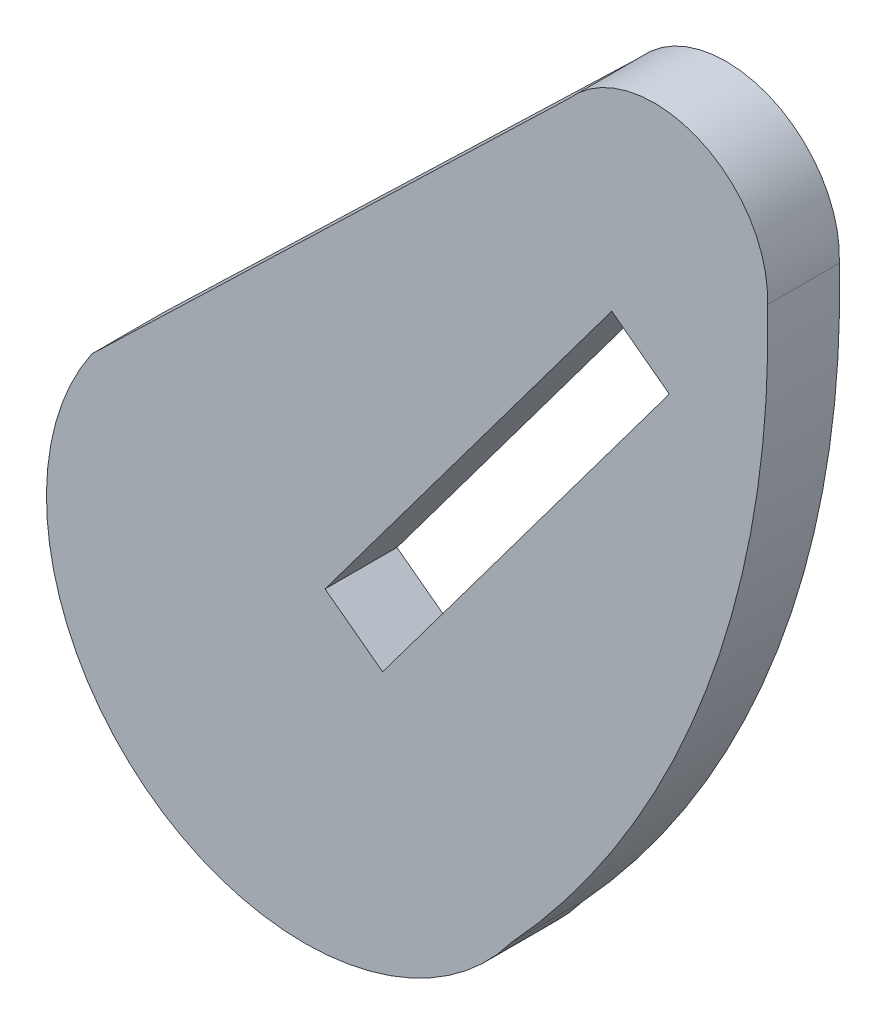
ISO-10303-21;
HEADER;
FILE_DESCRIPTION(('STEP AP214'),'2;1');
FILE_NAME('part.step','',(''),(''),'','','');
FILE_SCHEMA(('AUTOMOTIVE_DESIGN { 1 0 10303 214 1 1 1 1 }'));
ENDSEC;
DATA;
#1=APPLICATION_CONTEXT('core data for automotive mechanical design processes');
#2=APPLICATION_PROTOCOL_DEFINITION('international standard','automotive_design',2000,#1);
#3=PRODUCT_CONTEXT('',#1,'mechanical');
#4=PRODUCT('Part','Part','',(#3));
#5=PRODUCT_RELATED_PRODUCT_CATEGORY('part','',(#4));
#6=PRODUCT_DEFINITION_FORMATION('','',#4);
#7=PRODUCT_DEFINITION_CONTEXT('part definition',#1,'design');
#8=PRODUCT_DEFINITION('design','',#6,#7);
#9=PRODUCT_DEFINITION_SHAPE('','',#8);
#10=(LENGTH_UNIT() NAMED_UNIT(*) SI_UNIT(.MILLI.,.METRE.));
#11=(NAMED_UNIT(*) PLANE_ANGLE_UNIT() SI_UNIT($,.RADIAN.));
#12=(NAMED_UNIT(*) SI_UNIT($,.STERADIAN.) SOLID_ANGLE_UNIT());
#13=UNCERTAINTY_MEASURE_WITH_UNIT(LENGTH_MEASURE(1.E-05),#10,'distance_accuracy_value','');
#14=(GEOMETRIC_REPRESENTATION_CONTEXT(3) GLOBAL_UNCERTAINTY_ASSIGNED_CONTEXT((#13)) GLOBAL_UNIT_ASSIGNED_CONTEXT((#10,
#11,#12)) REPRESENTATION_CONTEXT('',''));
#15=CARTESIAN_POINT('',(0.,0.,0.));
#16=DIRECTION('',(0.,0.,1.));
#17=DIRECTION('',(1.,0.,0.));
#18=AXIS2_PLACEMENT_3D('',#15,#16,#17);
#19=CARTESIAN_POINT('',(-800.658033872501,-117.32718023379,3.));
#20=DIRECTION('',(0.,0.,1.));
#21=DIRECTION('',(1.,0.,0.));
#22=AXIS2_PLACEMENT_3D('',#19,#20,#21);
#23=PLANE('',#22);
#24=CARTESIAN_POINT('',(-800.658033872501,-117.32718023379,3.));
#25=DIRECTION('',(0.,0.,1.));
#26=DIRECTION('',(1.,0.,0.));
#27=AXIS2_PLACEMENT_3D('',#24,#25,#26);
#28=CIRCLE('',#27,10.7666614434912);
#29=CARTESIAN_POINT('',(-809.531671810658,-111.229676778992,3.));
#30=VERTEX_POINT('',#29);
#31=CARTESIAN_POINT('',(-792.031629072118,-123.769706047373,3.));
#32=VERTEX_POINT('',#31);
#33=EDGE_CURVE('E141',#30,#32,#28,.T.);
#34=ORIENTED_EDGE('',*,*,#33,.T.);
#35=CARTESIAN_POINT('',(-821.645619087199,-96.3880376426148,3.));
#36=DIRECTION('',(0.,0.,1.));
#37=DIRECTION('',(1.,0.,0.));
#38=AXIS2_PLACEMENT_3D('',#35,#36,#37);
#39=CIRCLE('',#38,40.3329166964334);
#40=CARTESIAN_POINT('',(-781.326120483584,-95.347748454672,3.));
#41=VERTEX_POINT('',#40);
#42=EDGE_CURVE('E144',#32,#41,#39,.T.);
#43=ORIENTED_EDGE('',*,*,#42,.T.);
#44=CARTESIAN_POINT('',(-786.047877368588,-95.1410879811995,3.));
#45=DIRECTION('',(0.,0.,1.));
#46=DIRECTION('',(1.,0.,0.));
#47=AXIS2_PLACEMENT_3D('',#44,#45,#46);
#48=CIRCLE('',#47,4.72627724878407);
#49=CARTESIAN_POINT('',(-789.614138010312,-92.0395590569968,3.));
#50=VERTEX_POINT('',#49);
#51=EDGE_CURVE('E146',#41,#50,#48,.T.);
#52=ORIENTED_EDGE('',*,*,#51,.T.);
#53=DIRECTION('',(-0.720134653279969,-0.693834332636645,0.));
#54=VECTOR('',#53,1.);
#55=CARTESIAN_POINT('',(-809.531671810658,-111.229676778992,3.));
#56=LINE('',#55,#54);
#57=EDGE_CURVE('E148',#50,#30,#56,.T.);
#58=ORIENTED_EDGE('',*,*,#57,.T.);
#59=EDGE_LOOP('',(#34,#43,#52,#58));
#60=FACE_BOUND('',#59,.T.);
#61=DIRECTION('',(0.598377300837106,0.801214456835933,0.));
#62=VECTOR('',#61,1.);
#63=CARTESIAN_POINT('',(-797.390770346987,-116.654380858265,3.));
#64=LINE('',#63,#62);
#65=CARTESIAN_POINT('',(-797.390770346987,-116.654380858265,3.));
#66=VERTEX_POINT('',#65);
#67=CARTESIAN_POINT('',(-785.423224330245,-100.630091721546,3.));
#68=VERTEX_POINT('',#67);
#69=EDGE_CURVE('E123',#66,#68,#64,.T.);
#70=ORIENTED_EDGE('',*,*,#69,.F.);
#71=DIRECTION('',(0.801214456835929,-0.598377300837112,0.));
#72=VECTOR('',#71,1.);
#73=CARTESIAN_POINT('',(-799.794413717495,-114.859248955753,3.));
#74=LINE('',#73,#72);
#75=CARTESIAN_POINT('',(-799.794413717495,-114.859248955753,3.));
#76=VERTEX_POINT('',#75);
#77=EDGE_CURVE('E112',#76,#66,#74,.T.);
#78=ORIENTED_EDGE('',*,*,#77,.F.);
#79=DIRECTION('',(-0.598377300837111,-0.80121445683593,0.));
#80=VECTOR('',#79,1.);
#81=CARTESIAN_POINT('',(-787.826867700752,-98.8349598190349,3.));
#82=LINE('',#81,#80);
#83=CARTESIAN_POINT('',(-787.826867700752,-98.8349598190349,3.));
#84=VERTEX_POINT('',#83);
#85=EDGE_CURVE('E127',#84,#76,#82,.T.);
#86=ORIENTED_EDGE('',*,*,#85,.F.);
#87=DIRECTION('',(-0.801214456835922,0.598377300837121,0.));
#88=VECTOR('',#87,1.);
#89=CARTESIAN_POINT('',(-785.423224330245,-100.630091721546,3.));
#90=LINE('',#89,#88);
#91=EDGE_CURVE('E125',#68,#84,#90,.T.);
#92=ORIENTED_EDGE('',*,*,#91,.F.);
#93=EDGE_LOOP('',(#70,#78,#86,#92));
#94=FACE_BOUND('',#93,.T.);
#95=ADVANCED_FACE('F32',(#60,#94),#23,.T.);
#96=CARTESIAN_POINT('',(-800.658033872501,-117.32718023379,0.));
#97=DIRECTION('',(0.,0.,1.));
#98=DIRECTION('',(1.,0.,0.));
#99=AXIS2_PLACEMENT_3D('',#96,#97,#98);
#100=PLANE('',#99);
#101=CARTESIAN_POINT('',(-800.658033872501,-117.32718023379,0.));
#102=DIRECTION('',(0.,0.,1.));
#103=DIRECTION('',(1.,0.,0.));
#104=AXIS2_PLACEMENT_3D('',#101,#102,#103);
#105=CIRCLE('',#104,10.7666614434912);
#106=CARTESIAN_POINT('',(-809.531671810658,-111.229676778992,0.));
#107=VERTEX_POINT('',#106);
#108=CARTESIAN_POINT('',(-792.031629072118,-123.769706047373,0.));
#109=VERTEX_POINT('',#108);
#110=EDGE_CURVE('E113',#107,#109,#105,.T.);
#111=ORIENTED_EDGE('',*,*,#110,.F.);
#112=DIRECTION('',(-0.720134653279969,-0.693834332636645,0.));
#113=VECTOR('',#112,1.);
#114=CARTESIAN_POINT('',(-809.531671810658,-111.229676778992,0.));
#115=LINE('',#114,#113);
#116=CARTESIAN_POINT('',(-789.614138010312,-92.0395590569968,0.));
#117=VERTEX_POINT('',#116);
#118=EDGE_CURVE('E139',#117,#107,#115,.T.);
#119=ORIENTED_EDGE('',*,*,#118,.F.);
#120=CARTESIAN_POINT('',(-786.047877368588,-95.1410879811995,0.));
#121=DIRECTION('',(0.,0.,1.));
#122=DIRECTION('',(1.,0.,0.));
#123=AXIS2_PLACEMENT_3D('',#120,#121,#122);
#124=CIRCLE('',#123,4.72627724878407);
#125=CARTESIAN_POINT('',(-781.326120483584,-95.347748454672,0.));
#126=VERTEX_POINT('',#125);
#127=EDGE_CURVE('E137',#126,#117,#124,.T.);
#128=ORIENTED_EDGE('',*,*,#127,.F.);
#129=CARTESIAN_POINT('',(-821.645619087199,-96.3880376426148,0.));
#130=DIRECTION('',(0.,0.,1.));
#131=DIRECTION('',(1.,0.,0.));
#132=AXIS2_PLACEMENT_3D('',#129,#130,#131);
#133=CIRCLE('',#132,40.3329166964334);
#134=EDGE_CURVE('E135',#109,#126,#133,.T.);
#135=ORIENTED_EDGE('',*,*,#134,.F.);
#136=EDGE_LOOP('',(#111,#119,#128,#135));
#137=FACE_BOUND('',#136,.T.);
#138=DIRECTION('',(0.801214456835929,-0.598377300837112,0.));
#139=VECTOR('',#138,1.);
#140=CARTESIAN_POINT('',(-799.794413717495,-114.859248955753,0.));
#141=LINE('',#140,#139);
#142=CARTESIAN_POINT('',(-799.794413717495,-114.859248955753,0.));
#143=VERTEX_POINT('',#142);
#144=CARTESIAN_POINT('',(-797.390770346987,-116.654380858265,0.));
#145=VERTEX_POINT('',#144);
#146=EDGE_CURVE('E55',#143,#145,#141,.T.);
#147=ORIENTED_EDGE('',*,*,#146,.T.);
#148=DIRECTION('',(0.598377300837106,0.801214456835933,0.));
#149=VECTOR('',#148,1.);
#150=CARTESIAN_POINT('',(-797.390770346987,-116.654380858265,0.));
#151=LINE('',#150,#149);
#152=CARTESIAN_POINT('',(-785.423224330245,-100.630091721546,0.));
#153=VERTEX_POINT('',#152);
#154=EDGE_CURVE('E99',#145,#153,#151,.T.);
#155=ORIENTED_EDGE('',*,*,#154,.T.);
#156=DIRECTION('',(-0.801214456835922,0.598377300837121,0.));
#157=VECTOR('',#156,1.);
#158=CARTESIAN_POINT('',(-785.423224330245,-100.630091721546,0.));
#159=LINE('',#158,#157);
#160=CARTESIAN_POINT('',(-787.826867700752,-98.8349598190349,0.));
#161=VERTEX_POINT('',#160);
#162=EDGE_CURVE('E108',#153,#161,#159,.T.);
#163=ORIENTED_EDGE('',*,*,#162,.T.);
#164=DIRECTION('',(-0.598377300837111,-0.80121445683593,0.));
#165=VECTOR('',#164,1.);
#166=CARTESIAN_POINT('',(-787.826867700752,-98.8349598190349,0.));
#167=LINE('',#166,#165);
#168=EDGE_CURVE('E117',#161,#143,#167,.T.);
#169=ORIENTED_EDGE('',*,*,#168,.T.);
#170=EDGE_LOOP('',(#147,#155,#163,#169));
#171=FACE_BOUND('',#170,.T.);
#172=ADVANCED_FACE('F116',(#137,#171),#100,.F.);
#173=CARTESIAN_POINT('',(-800.658033872501,-117.32718023379,3.));
#174=DIRECTION('',(0.,0.,-1.));
#175=DIRECTION('',(-1.,0.,0.));
#176=AXIS2_PLACEMENT_3D('',#173,#174,#175);
#177=CYLINDRICAL_SURFACE('',#176,10.7666614434912);
#178=ORIENTED_EDGE('',*,*,#110,.T.);
#179=DIRECTION('',(0.,0.,-1.));
#180=VECTOR('',#179,1.);
#181=CARTESIAN_POINT('',(-792.031629072118,-123.769706047373,3.));
#182=LINE('',#181,#180);
#183=EDGE_CURVE('E11',#32,#109,#182,.T.);
#184=ORIENTED_EDGE('',*,*,#183,.F.);
#185=ORIENTED_EDGE('',*,*,#33,.F.);
#186=DIRECTION('',(0.,0.,-1.));
#187=VECTOR('',#186,1.);
#188=CARTESIAN_POINT('',(-809.531671810658,-111.229676778992,3.));
#189=LINE('',#188,#187);
#190=EDGE_CURVE('E150',#30,#107,#189,.T.);
#191=ORIENTED_EDGE('',*,*,#190,.T.);
#192=EDGE_LOOP('',(#178,#184,#185,#191));
#193=FACE_BOUND('',#192,.T.);
#194=ADVANCED_FACE('F34',(#193),#177,.T.);
#195=CARTESIAN_POINT('',(-821.645619087199,-96.3880376426148,3.));
#196=DIRECTION('',(0.,0.,-1.));
#197=DIRECTION('',(-1.,0.,0.));
#198=AXIS2_PLACEMENT_3D('',#195,#196,#197);
#199=CYLINDRICAL_SURFACE('',#198,40.3329166964334);
#200=ORIENTED_EDGE('',*,*,#134,.T.);
#201=DIRECTION('',(0.,0.,-1.));
#202=VECTOR('',#201,1.);
#203=CARTESIAN_POINT('',(-781.326120483584,-95.347748454672,3.));
#204=LINE('',#203,#202);
#205=EDGE_CURVE('E40',#41,#126,#204,.T.);
#206=ORIENTED_EDGE('',*,*,#205,.F.);
#207=ORIENTED_EDGE('',*,*,#42,.F.);
#208=ORIENTED_EDGE('',*,*,#183,.T.);
#209=EDGE_LOOP('',(#200,#206,#207,#208));
#210=FACE_BOUND('',#209,.T.);
#211=ADVANCED_FACE('F175',(#210),#199,.T.);
#212=CARTESIAN_POINT('',(-786.047877368588,-95.1410879811995,3.));
#213=DIRECTION('',(0.,0.,-1.));
#214=DIRECTION('',(-1.,0.,0.));
#215=AXIS2_PLACEMENT_3D('',#212,#213,#214);
#216=CYLINDRICAL_SURFACE('',#215,4.72627724878407);
#217=ORIENTED_EDGE('',*,*,#127,.T.);
#218=DIRECTION('',(0.,0.,-1.));
#219=VECTOR('',#218,1.);
#220=CARTESIAN_POINT('',(-789.614138010312,-92.0395590569968,3.));
#221=LINE('',#220,#219);
#222=EDGE_CURVE('E153',#50,#117,#221,.T.);
#223=ORIENTED_EDGE('',*,*,#222,.F.);
#224=ORIENTED_EDGE('',*,*,#51,.F.);
#225=ORIENTED_EDGE('',*,*,#205,.T.);
#226=EDGE_LOOP('',(#217,#223,#224,#225));
#227=FACE_BOUND('',#226,.T.);
#228=ADVANCED_FACE('F160',(#227),#216,.T.);
#229=CARTESIAN_POINT('',(-809.531671810658,-111.229676778992,3.));
#230=DIRECTION('',(0.693834332636645,-0.720134653279969,0.));
#231=DIRECTION('',(0.720134653279969,0.693834332636646,0.));
#232=AXIS2_PLACEMENT_3D('',#229,#230,#231);
#233=PLANE('',#232);
#234=ORIENTED_EDGE('',*,*,#118,.T.);
#235=ORIENTED_EDGE('',*,*,#190,.F.);
#236=ORIENTED_EDGE('',*,*,#57,.F.);
#237=ORIENTED_EDGE('',*,*,#222,.T.);
#238=EDGE_LOOP('',(#234,#235,#236,#237));
#239=FACE_BOUND('',#238,.T.);
#240=ADVANCED_FACE('F168',(#239),#233,.F.);
#241=CARTESIAN_POINT('',(-799.794413717495,-114.859248955753,3.));
#242=DIRECTION('',(0.598377300837112,0.801214456835929,0.));
#243=DIRECTION('',(-0.801214456835929,0.598377300837112,0.));
#244=AXIS2_PLACEMENT_3D('',#241,#242,#243);
#245=PLANE('',#244);
#246=ORIENTED_EDGE('',*,*,#146,.F.);
#247=DIRECTION('',(0.,0.,-1.));
#248=VECTOR('',#247,1.);
#249=CARTESIAN_POINT('',(-799.794413717495,-114.859248955753,3.));
#250=LINE('',#249,#248);
#251=EDGE_CURVE('E129',#76,#143,#250,.T.);
#252=ORIENTED_EDGE('',*,*,#251,.F.);
#253=ORIENTED_EDGE('',*,*,#77,.T.);
#254=DIRECTION('',(0.,0.,-1.));
#255=VECTOR('',#254,1.);
#256=CARTESIAN_POINT('',(-797.390770346987,-116.654380858265,3.));
#257=LINE('',#256,#255);
#258=EDGE_CURVE('E101',#66,#145,#257,.T.);
#259=ORIENTED_EDGE('',*,*,#258,.T.);
#260=EDGE_LOOP('',(#246,#252,#253,#259));
#261=FACE_BOUND('',#260,.T.);
#262=ADVANCED_FACE('F110',(#261),#245,.T.);
#263=CARTESIAN_POINT('',(-797.390770346987,-116.654380858265,3.));
#264=DIRECTION('',(-0.801214456835933,0.598377300837106,0.));
#265=DIRECTION('',(-0.598377300837106,-0.801214456835933,0.));
#266=AXIS2_PLACEMENT_3D('',#263,#264,#265);
#267=PLANE('',#266);
#268=ORIENTED_EDGE('',*,*,#154,.F.);
#269=ORIENTED_EDGE('',*,*,#258,.F.);
#270=ORIENTED_EDGE('',*,*,#69,.T.);
#271=DIRECTION('',(0.,0.,-1.));
#272=VECTOR('',#271,1.);
#273=CARTESIAN_POINT('',(-785.423224330245,-100.630091721546,3.));
#274=LINE('',#273,#272);
#275=EDGE_CURVE('E104',#68,#153,#274,.T.);
#276=ORIENTED_EDGE('',*,*,#275,.T.);
#277=EDGE_LOOP('',(#268,#269,#270,#276));
#278=FACE_BOUND('',#277,.T.);
#279=ADVANCED_FACE('F100',(#278),#267,.T.);
#280=CARTESIAN_POINT('',(-785.423224330245,-100.630091721546,3.));
#281=DIRECTION('',(-0.598377300837121,-0.801214456835922,0.));
#282=DIRECTION('',(0.801214456835922,-0.598377300837121,0.));
#283=AXIS2_PLACEMENT_3D('',#280,#281,#282);
#284=PLANE('',#283);
#285=ORIENTED_EDGE('',*,*,#162,.F.);
#286=ORIENTED_EDGE('',*,*,#275,.F.);
#287=ORIENTED_EDGE('',*,*,#91,.T.);
#288=DIRECTION('',(0.,0.,-1.));
#289=VECTOR('',#288,1.);
#290=CARTESIAN_POINT('',(-787.826867700752,-98.8349598190349,3.));
#291=LINE('',#290,#289);
#292=EDGE_CURVE('E47',#84,#161,#291,.T.);
#293=ORIENTED_EDGE('',*,*,#292,.T.);
#294=EDGE_LOOP('',(#285,#286,#287,#293));
#295=FACE_BOUND('',#294,.T.);
#296=ADVANCED_FACE('F197',(#295),#284,.T.);
#297=CARTESIAN_POINT('',(-787.826867700752,-98.8349598190349,3.));
#298=DIRECTION('',(0.80121445683593,-0.598377300837111,0.));
#299=DIRECTION('',(0.598377300837111,0.80121445683593,0.));
#300=AXIS2_PLACEMENT_3D('',#297,#298,#299);
#301=PLANE('',#300);
#302=ORIENTED_EDGE('',*,*,#168,.F.);
#303=ORIENTED_EDGE('',*,*,#292,.F.);
#304=ORIENTED_EDGE('',*,*,#85,.T.);
#305=ORIENTED_EDGE('',*,*,#251,.T.);
#306=EDGE_LOOP('',(#302,#303,#304,#305));
#307=FACE_BOUND('',#306,.T.);
#308=ADVANCED_FACE('F202',(#307),#301,.T.);
#309=CLOSED_SHELL('',(#95,#172,#194,#211,#228,#240,#262,#279,#296,#308));
#310=MANIFOLD_SOLID_BREP('B2',#309);
#311=ADVANCED_BREP_SHAPE_REPRESENTATION('',(#18,#310),#14);
#312=SHAPE_DEFINITION_REPRESENTATION(#9,#311);
ENDSEC;
END-ISO-10303-21;
